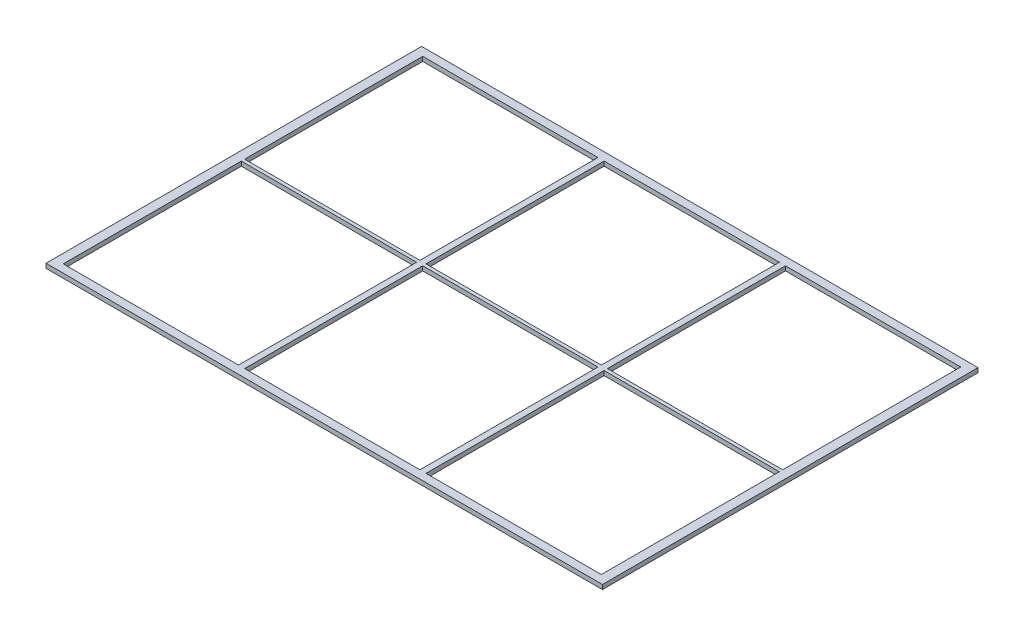
ISO-10303-21;
HEADER;
FILE_DESCRIPTION(('STEP AP214'),'2;1');
FILE_NAME('part.step','',(''),(''),'','','');
FILE_SCHEMA(('AUTOMOTIVE_DESIGN { 1 0 10303 214 1 1 1 1 }'));
ENDSEC;
DATA;
#1=APPLICATION_CONTEXT('core data for automotive mechanical design processes');
#2=APPLICATION_PROTOCOL_DEFINITION('international standard','automotive_design',2000,#1);
#3=PRODUCT_CONTEXT('',#1,'mechanical');
#4=PRODUCT('Part','Part','',(#3));
#5=PRODUCT_RELATED_PRODUCT_CATEGORY('part','',(#4));
#6=PRODUCT_DEFINITION_FORMATION('','',#4);
#7=PRODUCT_DEFINITION_CONTEXT('part definition',#1,'design');
#8=PRODUCT_DEFINITION('design','',#6,#7);
#9=PRODUCT_DEFINITION_SHAPE('','',#8);
#10=(LENGTH_UNIT() NAMED_UNIT(*) SI_UNIT(.MILLI.,.METRE.));
#11=(NAMED_UNIT(*) PLANE_ANGLE_UNIT() SI_UNIT($,.RADIAN.));
#12=(NAMED_UNIT(*) SI_UNIT($,.STERADIAN.) SOLID_ANGLE_UNIT());
#13=UNCERTAINTY_MEASURE_WITH_UNIT(LENGTH_MEASURE(1.E-05),#10,'distance_accuracy_value','');
#14=(GEOMETRIC_REPRESENTATION_CONTEXT(3) GLOBAL_UNCERTAINTY_ASSIGNED_CONTEXT((#13)) GLOBAL_UNIT_ASSIGNED_CONTEXT((#10,
#11,#12)) REPRESENTATION_CONTEXT('',''));
#15=CARTESIAN_POINT('',(0.,0.,0.));
#16=DIRECTION('',(0.,0.,1.));
#17=DIRECTION('',(1.,0.,0.));
#18=AXIS2_PLACEMENT_3D('',#15,#16,#17);
#19=CARTESIAN_POINT('',(33.7,0.,64.6));
#20=DIRECTION('',(0.,0.,1.));
#21=DIRECTION('',(1.,0.,0.));
#22=AXIS2_PLACEMENT_3D('',#19,#20,#21);
#23=PLANE('',#22);
#24=DIRECTION('',(1.,0.,0.));
#25=VECTOR('',#24,1.);
#26=CARTESIAN_POINT('',(33.7,1.6,64.6));
#27=LINE('',#26,#25);
#28=CARTESIAN_POINT('',(33.7,1.6,64.6));
#29=VERTEX_POINT('',#28);
#30=CARTESIAN_POINT('',(96.7,1.6,64.6));
#31=VERTEX_POINT('',#30);
#32=EDGE_CURVE('E513',#29,#31,#27,.T.);
#33=ORIENTED_EDGE('',*,*,#32,.T.);
#34=DIRECTION('',(0.,1.,0.));
#35=VECTOR('',#34,1.);
#36=CARTESIAN_POINT('',(96.7,0.,64.6));
#37=LINE('',#36,#35);
#38=CARTESIAN_POINT('',(96.7,0.,64.6));
#39=VERTEX_POINT('',#38);
#40=EDGE_CURVE('E11',#39,#31,#37,.T.);
#41=ORIENTED_EDGE('',*,*,#40,.F.);
#42=DIRECTION('',(1.,0.,0.));
#43=VECTOR('',#42,1.);
#44=CARTESIAN_POINT('',(33.7,0.,64.6));
#45=LINE('',#44,#43);
#46=CARTESIAN_POINT('',(33.7,0.,64.6));
#47=VERTEX_POINT('',#46);
#48=EDGE_CURVE('E519',#47,#39,#45,.T.);
#49=ORIENTED_EDGE('',*,*,#48,.F.);
#50=DIRECTION('',(0.,1.,0.));
#51=VECTOR('',#50,1.);
#52=CARTESIAN_POINT('',(33.7,0.,64.6));
#53=LINE('',#52,#51);
#54=EDGE_CURVE('E527',#47,#29,#53,.T.);
#55=ORIENTED_EDGE('',*,*,#54,.T.);
#56=EDGE_LOOP('',(#33,#41,#49,#55));
#57=FACE_BOUND('',#56,.T.);
#58=ADVANCED_FACE('F45',(#57),#23,.F.);
#59=CARTESIAN_POINT('',(96.7,0.,0.599999999999976));
#60=DIRECTION('',(1.,0.,0.));
#61=DIRECTION('',(0.,0.,-1.));
#62=AXIS2_PLACEMENT_3D('',#59,#60,#61);
#63=PLANE('',#62);
#64=DIRECTION('',(0.,0.,-1.));
#65=VECTOR('',#64,1.);
#66=CARTESIAN_POINT('',(96.7,1.6,0.599999999999976));
#67=LINE('',#66,#65);
#68=CARTESIAN_POINT('',(96.7,1.6,0.599999999999976));
#69=VERTEX_POINT('',#68);
#70=EDGE_CURVE('E509',#31,#69,#67,.T.);
#71=ORIENTED_EDGE('',*,*,#70,.T.);
#72=DIRECTION('',(0.,1.,0.));
#73=VECTOR('',#72,1.);
#74=CARTESIAN_POINT('',(96.7,0.,0.599999999999976));
#75=LINE('',#74,#73);
#76=CARTESIAN_POINT('',(96.7,0.,0.599999999999976));
#77=VERTEX_POINT('',#76);
#78=EDGE_CURVE('E53',#77,#69,#75,.T.);
#79=ORIENTED_EDGE('',*,*,#78,.F.);
#80=DIRECTION('',(0.,0.,-1.));
#81=VECTOR('',#80,1.);
#82=CARTESIAN_POINT('',(96.7,0.,0.599999999999976));
#83=LINE('',#82,#81);
#84=EDGE_CURVE('E67',#39,#77,#83,.T.);
#85=ORIENTED_EDGE('',*,*,#84,.F.);
#86=ORIENTED_EDGE('',*,*,#40,.T.);
#87=EDGE_LOOP('',(#71,#79,#85,#86));
#88=FACE_BOUND('',#87,.T.);
#89=ADVANCED_FACE('F540',(#88),#63,.F.);
#90=CARTESIAN_POINT('',(33.7,0.,0.599999999999976));
#91=DIRECTION('',(0.,0.,-1.));
#92=DIRECTION('',(-1.,0.,0.));
#93=AXIS2_PLACEMENT_3D('',#90,#91,#92);
#94=PLANE('',#93);
#95=DIRECTION('',(-1.,0.,0.));
#96=VECTOR('',#95,1.);
#97=CARTESIAN_POINT('',(33.7,1.6,0.599999999999976));
#98=LINE('',#97,#96);
#99=CARTESIAN_POINT('',(33.7,1.6,0.599999999999976));
#100=VERTEX_POINT('',#99);
#101=EDGE_CURVE('E505',#69,#100,#98,.T.);
#102=ORIENTED_EDGE('',*,*,#101,.T.);
#103=DIRECTION('',(0.,1.,0.));
#104=VECTOR('',#103,1.);
#105=CARTESIAN_POINT('',(33.7,0.,0.599999999999976));
#106=LINE('',#105,#104);
#107=CARTESIAN_POINT('',(33.7,0.,0.599999999999976));
#108=VERTEX_POINT('',#107);
#109=EDGE_CURVE('E531',#108,#100,#106,.T.);
#110=ORIENTED_EDGE('',*,*,#109,.F.);
#111=DIRECTION('',(-1.,0.,0.));
#112=VECTOR('',#111,1.);
#113=CARTESIAN_POINT('',(33.7,0.,0.599999999999976));
#114=LINE('',#113,#112);
#115=EDGE_CURVE('E524',#77,#108,#114,.T.);
#116=ORIENTED_EDGE('',*,*,#115,.F.);
#117=ORIENTED_EDGE('',*,*,#78,.T.);
#118=EDGE_LOOP('',(#102,#110,#116,#117));
#119=FACE_BOUND('',#118,.T.);
#120=ADVANCED_FACE('F537',(#119),#94,.F.);
#121=CARTESIAN_POINT('',(33.7,0.,0.599999999999976));
#122=DIRECTION('',(-1.,0.,0.));
#123=DIRECTION('',(0.,0.,1.));
#124=AXIS2_PLACEMENT_3D('',#121,#122,#123);
#125=PLANE('',#124);
#126=DIRECTION('',(0.,0.,1.));
#127=VECTOR('',#126,1.);
#128=CARTESIAN_POINT('',(33.7,1.6,0.599999999999976));
#129=LINE('',#128,#127);
#130=EDGE_CURVE('E502',#100,#29,#129,.T.);
#131=ORIENTED_EDGE('',*,*,#130,.T.);
#132=ORIENTED_EDGE('',*,*,#54,.F.);
#133=DIRECTION('',(0.,0.,1.));
#134=VECTOR('',#133,1.);
#135=CARTESIAN_POINT('',(33.7,0.,0.599999999999976));
#136=LINE('',#135,#134);
#137=EDGE_CURVE('E60',#108,#47,#136,.T.);
#138=ORIENTED_EDGE('',*,*,#137,.F.);
#139=ORIENTED_EDGE('',*,*,#109,.T.);
#140=EDGE_LOOP('',(#131,#132,#138,#139));
#141=FACE_BOUND('',#140,.T.);
#142=ADVANCED_FACE('F546',(#141),#125,.F.);
#143=CARTESIAN_POINT('',(-31.5,0.,64.6));
#144=DIRECTION('',(0.,0.,1.));
#145=DIRECTION('',(1.,0.,0.));
#146=AXIS2_PLACEMENT_3D('',#143,#144,#145);
#147=PLANE('',#146);
#148=DIRECTION('',(1.,0.,0.));
#149=VECTOR('',#148,1.);
#150=CARTESIAN_POINT('',(-31.5,1.6,64.6));
#151=LINE('',#150,#149);
#152=CARTESIAN_POINT('',(-31.5,1.6,64.6));
#153=VERTEX_POINT('',#152);
#154=CARTESIAN_POINT('',(31.5,1.6,64.6));
#155=VERTEX_POINT('',#154);
#156=EDGE_CURVE('E469',#153,#155,#151,.T.);
#157=ORIENTED_EDGE('',*,*,#156,.T.);
#158=DIRECTION('',(0.,1.,0.));
#159=VECTOR('',#158,1.);
#160=CARTESIAN_POINT('',(31.5,0.,64.6));
#161=LINE('',#160,#159);
#162=CARTESIAN_POINT('',(31.5,0.,64.6));
#163=VERTEX_POINT('',#162);
#164=EDGE_CURVE('E498',#163,#155,#161,.T.);
#165=ORIENTED_EDGE('',*,*,#164,.F.);
#166=DIRECTION('',(1.,0.,0.));
#167=VECTOR('',#166,1.);
#168=CARTESIAN_POINT('',(-31.5,0.,64.6));
#169=LINE('',#168,#167);
#170=CARTESIAN_POINT('',(-31.5,0.,64.6));
#171=VERTEX_POINT('',#170);
#172=EDGE_CURVE('E476',#171,#163,#169,.T.);
#173=ORIENTED_EDGE('',*,*,#172,.F.);
#174=DIRECTION('',(0.,1.,0.));
#175=VECTOR('',#174,1.);
#176=CARTESIAN_POINT('',(-31.5,0.,64.6));
#177=LINE('',#176,#175);
#178=EDGE_CURVE('E486',#171,#153,#177,.T.);
#179=ORIENTED_EDGE('',*,*,#178,.T.);
#180=EDGE_LOOP('',(#157,#165,#173,#179));
#181=FACE_BOUND('',#180,.T.);
#182=ADVANCED_FACE('F548',(#181),#147,.F.);
#183=CARTESIAN_POINT('',(31.5,0.,0.599999999999976));
#184=DIRECTION('',(1.,0.,0.));
#185=DIRECTION('',(0.,0.,-1.));
#186=AXIS2_PLACEMENT_3D('',#183,#184,#185);
#187=PLANE('',#186);
#188=DIRECTION('',(0.,0.,-1.));
#189=VECTOR('',#188,1.);
#190=CARTESIAN_POINT('',(31.5,1.6,0.599999999999976));
#191=LINE('',#190,#189);
#192=CARTESIAN_POINT('',(31.5,1.6,0.599999999999976));
#193=VERTEX_POINT('',#192);
#194=EDGE_CURVE('E465',#155,#193,#191,.T.);
#195=ORIENTED_EDGE('',*,*,#194,.T.);
#196=DIRECTION('',(0.,1.,0.));
#197=VECTOR('',#196,1.);
#198=CARTESIAN_POINT('',(31.5,0.,0.599999999999976));
#199=LINE('',#198,#197);
#200=CARTESIAN_POINT('',(31.5,0.,0.599999999999976));
#201=VERTEX_POINT('',#200);
#202=EDGE_CURVE('E494',#201,#193,#199,.T.);
#203=ORIENTED_EDGE('',*,*,#202,.F.);
#204=DIRECTION('',(0.,0.,-1.));
#205=VECTOR('',#204,1.);
#206=CARTESIAN_POINT('',(31.5,0.,0.599999999999976));
#207=LINE('',#206,#205);
#208=EDGE_CURVE('E479',#163,#201,#207,.T.);
#209=ORIENTED_EDGE('',*,*,#208,.F.);
#210=ORIENTED_EDGE('',*,*,#164,.T.);
#211=EDGE_LOOP('',(#195,#203,#209,#210));
#212=FACE_BOUND('',#211,.T.);
#213=ADVANCED_FACE('F554',(#212),#187,.F.);
#214=CARTESIAN_POINT('',(-31.5,0.,0.599999999999976));
#215=DIRECTION('',(0.,0.,-1.));
#216=DIRECTION('',(-1.,0.,0.));
#217=AXIS2_PLACEMENT_3D('',#214,#215,#216);
#218=PLANE('',#217);
#219=DIRECTION('',(-1.,0.,0.));
#220=VECTOR('',#219,1.);
#221=CARTESIAN_POINT('',(-31.5,1.6,0.599999999999976));
#222=LINE('',#221,#220);
#223=CARTESIAN_POINT('',(-31.5,1.6,0.599999999999976));
#224=VERTEX_POINT('',#223);
#225=EDGE_CURVE('E461',#193,#224,#222,.T.);
#226=ORIENTED_EDGE('',*,*,#225,.T.);
#227=DIRECTION('',(0.,1.,0.));
#228=VECTOR('',#227,1.);
#229=CARTESIAN_POINT('',(-31.5,0.,0.599999999999976));
#230=LINE('',#229,#228);
#231=CARTESIAN_POINT('',(-31.5,0.,0.599999999999976));
#232=VERTEX_POINT('',#231);
#233=EDGE_CURVE('E490',#232,#224,#230,.T.);
#234=ORIENTED_EDGE('',*,*,#233,.F.);
#235=DIRECTION('',(-1.,0.,0.));
#236=VECTOR('',#235,1.);
#237=CARTESIAN_POINT('',(-31.5,0.,0.599999999999976));
#238=LINE('',#237,#236);
#239=EDGE_CURVE('E482',#201,#232,#238,.T.);
#240=ORIENTED_EDGE('',*,*,#239,.F.);
#241=ORIENTED_EDGE('',*,*,#202,.T.);
#242=EDGE_LOOP('',(#226,#234,#240,#241));
#243=FACE_BOUND('',#242,.T.);
#244=ADVANCED_FACE('F590',(#243),#218,.F.);
#245=CARTESIAN_POINT('',(-31.5,0.,0.599999999999976));
#246=DIRECTION('',(-1.,0.,0.));
#247=DIRECTION('',(0.,0.,1.));
#248=AXIS2_PLACEMENT_3D('',#245,#246,#247);
#249=PLANE('',#248);
#250=DIRECTION('',(0.,0.,1.));
#251=VECTOR('',#250,1.);
#252=CARTESIAN_POINT('',(-31.5,1.6,0.599999999999976));
#253=LINE('',#252,#251);
#254=EDGE_CURVE('E458',#224,#153,#253,.T.);
#255=ORIENTED_EDGE('',*,*,#254,.T.);
#256=ORIENTED_EDGE('',*,*,#178,.F.);
#257=DIRECTION('',(0.,0.,1.));
#258=VECTOR('',#257,1.);
#259=CARTESIAN_POINT('',(-31.5,0.,0.599999999999976));
#260=LINE('',#259,#258);
#261=EDGE_CURVE('E473',#232,#171,#260,.T.);
#262=ORIENTED_EDGE('',*,*,#261,.F.);
#263=ORIENTED_EDGE('',*,*,#233,.T.);
#264=EDGE_LOOP('',(#255,#256,#262,#263));
#265=FACE_BOUND('',#264,.T.);
#266=ADVANCED_FACE('F600',(#265),#249,.F.);
#267=CARTESIAN_POINT('',(-96.7,0.,64.6));
#268=DIRECTION('',(0.,0.,1.));
#269=DIRECTION('',(1.,0.,0.));
#270=AXIS2_PLACEMENT_3D('',#267,#268,#269);
#271=PLANE('',#270);
#272=DIRECTION('',(1.,0.,0.));
#273=VECTOR('',#272,1.);
#274=CARTESIAN_POINT('',(-96.7,1.6,64.6));
#275=LINE('',#274,#273);
#276=CARTESIAN_POINT('',(-96.7,1.6,64.6));
#277=VERTEX_POINT('',#276);
#278=CARTESIAN_POINT('',(-33.7,1.6,64.6));
#279=VERTEX_POINT('',#278);
#280=EDGE_CURVE('E425',#277,#279,#275,.T.);
#281=ORIENTED_EDGE('',*,*,#280,.T.);
#282=DIRECTION('',(0.,1.,0.));
#283=VECTOR('',#282,1.);
#284=CARTESIAN_POINT('',(-33.7,0.,64.6));
#285=LINE('',#284,#283);
#286=CARTESIAN_POINT('',(-33.7,0.,64.6));
#287=VERTEX_POINT('',#286);
#288=EDGE_CURVE('E454',#287,#279,#285,.T.);
#289=ORIENTED_EDGE('',*,*,#288,.F.);
#290=DIRECTION('',(1.,0.,0.));
#291=VECTOR('',#290,1.);
#292=CARTESIAN_POINT('',(-96.7,0.,64.6));
#293=LINE('',#292,#291);
#294=CARTESIAN_POINT('',(-96.7,0.,64.6));
#295=VERTEX_POINT('',#294);
#296=EDGE_CURVE('E432',#295,#287,#293,.T.);
#297=ORIENTED_EDGE('',*,*,#296,.F.);
#298=DIRECTION('',(0.,1.,0.));
#299=VECTOR('',#298,1.);
#300=CARTESIAN_POINT('',(-96.7,0.,64.6));
#301=LINE('',#300,#299);
#302=EDGE_CURVE('E442',#295,#277,#301,.T.);
#303=ORIENTED_EDGE('',*,*,#302,.T.);
#304=EDGE_LOOP('',(#281,#289,#297,#303));
#305=FACE_BOUND('',#304,.T.);
#306=ADVANCED_FACE('F610',(#305),#271,.F.);
#307=CARTESIAN_POINT('',(-33.7,0.,0.599999999999989));
#308=DIRECTION('',(1.,0.,0.));
#309=DIRECTION('',(0.,0.,-1.));
#310=AXIS2_PLACEMENT_3D('',#307,#308,#309);
#311=PLANE('',#310);
#312=DIRECTION('',(0.,0.,-1.));
#313=VECTOR('',#312,1.);
#314=CARTESIAN_POINT('',(-33.7,1.6,0.599999999999989));
#315=LINE('',#314,#313);
#316=CARTESIAN_POINT('',(-33.7,1.6,0.599999999999989));
#317=VERTEX_POINT('',#316);
#318=EDGE_CURVE('E421',#279,#317,#315,.T.);
#319=ORIENTED_EDGE('',*,*,#318,.T.);
#320=DIRECTION('',(0.,1.,0.));
#321=VECTOR('',#320,1.);
#322=CARTESIAN_POINT('',(-33.7,0.,0.599999999999989));
#323=LINE('',#322,#321);
#324=CARTESIAN_POINT('',(-33.7,0.,0.599999999999989));
#325=VERTEX_POINT('',#324);
#326=EDGE_CURVE('E450',#325,#317,#323,.T.);
#327=ORIENTED_EDGE('',*,*,#326,.F.);
#328=DIRECTION('',(0.,0.,-1.));
#329=VECTOR('',#328,1.);
#330=CARTESIAN_POINT('',(-33.7,0.,0.599999999999989));
#331=LINE('',#330,#329);
#332=EDGE_CURVE('E435',#287,#325,#331,.T.);
#333=ORIENTED_EDGE('',*,*,#332,.F.);
#334=ORIENTED_EDGE('',*,*,#288,.T.);
#335=EDGE_LOOP('',(#319,#327,#333,#334));
#336=FACE_BOUND('',#335,.T.);
#337=ADVANCED_FACE('F620',(#336),#311,.F.);
#338=CARTESIAN_POINT('',(-96.7,0.,0.599999999999989));
#339=DIRECTION('',(0.,0.,-1.));
#340=DIRECTION('',(-1.,0.,0.));
#341=AXIS2_PLACEMENT_3D('',#338,#339,#340);
#342=PLANE('',#341);
#343=DIRECTION('',(-1.,0.,0.));
#344=VECTOR('',#343,1.);
#345=CARTESIAN_POINT('',(-96.7,1.6,0.599999999999989));
#346=LINE('',#345,#344);
#347=CARTESIAN_POINT('',(-96.7,1.6,0.599999999999989));
#348=VERTEX_POINT('',#347);
#349=EDGE_CURVE('E417',#317,#348,#346,.T.);
#350=ORIENTED_EDGE('',*,*,#349,.T.);
#351=DIRECTION('',(0.,1.,0.));
#352=VECTOR('',#351,1.);
#353=CARTESIAN_POINT('',(-96.7,0.,0.599999999999989));
#354=LINE('',#353,#352);
#355=CARTESIAN_POINT('',(-96.7,0.,0.599999999999989));
#356=VERTEX_POINT('',#355);
#357=EDGE_CURVE('E446',#356,#348,#354,.T.);
#358=ORIENTED_EDGE('',*,*,#357,.F.);
#359=DIRECTION('',(-1.,0.,0.));
#360=VECTOR('',#359,1.);
#361=CARTESIAN_POINT('',(-96.7,0.,0.599999999999989));
#362=LINE('',#361,#360);
#363=EDGE_CURVE('E438',#325,#356,#362,.T.);
#364=ORIENTED_EDGE('',*,*,#363,.F.);
#365=ORIENTED_EDGE('',*,*,#326,.T.);
#366=EDGE_LOOP('',(#350,#358,#364,#365));
#367=FACE_BOUND('',#366,.T.);
#368=ADVANCED_FACE('F630',(#367),#342,.F.);
#369=CARTESIAN_POINT('',(-96.7,0.,0.599999999999989));
#370=DIRECTION('',(-1.,0.,0.));
#371=DIRECTION('',(0.,0.,1.));
#372=AXIS2_PLACEMENT_3D('',#369,#370,#371);
#373=PLANE('',#372);
#374=DIRECTION('',(0.,0.,1.));
#375=VECTOR('',#374,1.);
#376=CARTESIAN_POINT('',(-96.7,1.6,0.599999999999989));
#377=LINE('',#376,#375);
#378=EDGE_CURVE('E414',#348,#277,#377,.T.);
#379=ORIENTED_EDGE('',*,*,#378,.T.);
#380=ORIENTED_EDGE('',*,*,#302,.F.);
#381=DIRECTION('',(0.,0.,1.));
#382=VECTOR('',#381,1.);
#383=CARTESIAN_POINT('',(-96.7,0.,0.599999999999989));
#384=LINE('',#383,#382);
#385=EDGE_CURVE('E429',#356,#295,#384,.T.);
#386=ORIENTED_EDGE('',*,*,#385,.F.);
#387=ORIENTED_EDGE('',*,*,#357,.T.);
#388=EDGE_LOOP('',(#379,#380,#386,#387));
#389=FACE_BOUND('',#388,.T.);
#390=ADVANCED_FACE('F640',(#389),#373,.F.);
#391=CARTESIAN_POINT('',(33.7,0.,-0.600000000000035));
#392=DIRECTION('',(0.,0.,1.));
#393=DIRECTION('',(1.,0.,0.));
#394=AXIS2_PLACEMENT_3D('',#391,#392,#393);
#395=PLANE('',#394);
#396=DIRECTION('',(1.,0.,0.));
#397=VECTOR('',#396,1.);
#398=CARTESIAN_POINT('',(33.7,1.6,-0.600000000000035));
#399=LINE('',#398,#397);
#400=CARTESIAN_POINT('',(33.7,1.6,-0.600000000000035));
#401=VERTEX_POINT('',#400);
#402=CARTESIAN_POINT('',(96.7,1.6,-0.600000000000035));
#403=VERTEX_POINT('',#402);
#404=EDGE_CURVE('E381',#401,#403,#399,.T.);
#405=ORIENTED_EDGE('',*,*,#404,.T.);
#406=DIRECTION('',(0.,1.,0.));
#407=VECTOR('',#406,1.);
#408=CARTESIAN_POINT('',(96.7,0.,-0.600000000000035));
#409=LINE('',#408,#407);
#410=CARTESIAN_POINT('',(96.7,0.,-0.600000000000035));
#411=VERTEX_POINT('',#410);
#412=EDGE_CURVE('E410',#411,#403,#409,.T.);
#413=ORIENTED_EDGE('',*,*,#412,.F.);
#414=DIRECTION('',(1.,0.,0.));
#415=VECTOR('',#414,1.);
#416=CARTESIAN_POINT('',(33.7,0.,-0.600000000000035));
#417=LINE('',#416,#415);
#418=CARTESIAN_POINT('',(33.7,0.,-0.600000000000035));
#419=VERTEX_POINT('',#418);
#420=EDGE_CURVE('E388',#419,#411,#417,.T.);
#421=ORIENTED_EDGE('',*,*,#420,.F.);
#422=DIRECTION('',(0.,1.,0.));
#423=VECTOR('',#422,1.);
#424=CARTESIAN_POINT('',(33.7,0.,-0.600000000000035));
#425=LINE('',#424,#423);
#426=EDGE_CURVE('E398',#419,#401,#425,.T.);
#427=ORIENTED_EDGE('',*,*,#426,.T.);
#428=EDGE_LOOP('',(#405,#413,#421,#427));
#429=FACE_BOUND('',#428,.T.);
#430=ADVANCED_FACE('F650',(#429),#395,.F.);
#431=CARTESIAN_POINT('',(96.7,0.,-64.6000000000001));
#432=DIRECTION('',(1.,0.,0.));
#433=DIRECTION('',(0.,0.,-1.));
#434=AXIS2_PLACEMENT_3D('',#431,#432,#433);
#435=PLANE('',#434);
#436=DIRECTION('',(0.,0.,-1.));
#437=VECTOR('',#436,1.);
#438=CARTESIAN_POINT('',(96.7,1.6,-64.6000000000001));
#439=LINE('',#438,#437);
#440=CARTESIAN_POINT('',(96.7,1.6,-64.6000000000001));
#441=VERTEX_POINT('',#440);
#442=EDGE_CURVE('E377',#403,#441,#439,.T.);
#443=ORIENTED_EDGE('',*,*,#442,.T.);
#444=DIRECTION('',(0.,1.,0.));
#445=VECTOR('',#444,1.);
#446=CARTESIAN_POINT('',(96.7,0.,-64.6000000000001));
#447=LINE('',#446,#445);
#448=CARTESIAN_POINT('',(96.7,0.,-64.6000000000001));
#449=VERTEX_POINT('',#448);
#450=EDGE_CURVE('E406',#449,#441,#447,.T.);
#451=ORIENTED_EDGE('',*,*,#450,.F.);
#452=DIRECTION('',(0.,0.,-1.));
#453=VECTOR('',#452,1.);
#454=CARTESIAN_POINT('',(96.7,0.,-64.6000000000001));
#455=LINE('',#454,#453);
#456=EDGE_CURVE('E391',#411,#449,#455,.T.);
#457=ORIENTED_EDGE('',*,*,#456,.F.);
#458=ORIENTED_EDGE('',*,*,#412,.T.);
#459=EDGE_LOOP('',(#443,#451,#457,#458));
#460=FACE_BOUND('',#459,.T.);
#461=ADVANCED_FACE('F660',(#460),#435,.F.);
#462=CARTESIAN_POINT('',(33.7,0.,-64.6000000000001));
#463=DIRECTION('',(0.,0.,-1.));
#464=DIRECTION('',(-1.,0.,0.));
#465=AXIS2_PLACEMENT_3D('',#462,#463,#464);
#466=PLANE('',#465);
#467=DIRECTION('',(-1.,0.,0.));
#468=VECTOR('',#467,1.);
#469=CARTESIAN_POINT('',(33.7,1.6,-64.6000000000001));
#470=LINE('',#469,#468);
#471=CARTESIAN_POINT('',(33.7,1.6,-64.6000000000001));
#472=VERTEX_POINT('',#471);
#473=EDGE_CURVE('E373',#441,#472,#470,.T.);
#474=ORIENTED_EDGE('',*,*,#473,.T.);
#475=DIRECTION('',(0.,1.,0.));
#476=VECTOR('',#475,1.);
#477=CARTESIAN_POINT('',(33.7,0.,-64.6000000000001));
#478=LINE('',#477,#476);
#479=CARTESIAN_POINT('',(33.7,0.,-64.6000000000001));
#480=VERTEX_POINT('',#479);
#481=EDGE_CURVE('E402',#480,#472,#478,.T.);
#482=ORIENTED_EDGE('',*,*,#481,.F.);
#483=DIRECTION('',(-1.,0.,0.));
#484=VECTOR('',#483,1.);
#485=CARTESIAN_POINT('',(33.7,0.,-64.6000000000001));
#486=LINE('',#485,#484);
#487=EDGE_CURVE('E394',#449,#480,#486,.T.);
#488=ORIENTED_EDGE('',*,*,#487,.F.);
#489=ORIENTED_EDGE('',*,*,#450,.T.);
#490=EDGE_LOOP('',(#474,#482,#488,#489));
#491=FACE_BOUND('',#490,.T.);
#492=ADVANCED_FACE('F670',(#491),#466,.F.);
#493=CARTESIAN_POINT('',(33.7,0.,-64.6000000000001));
#494=DIRECTION('',(-1.,0.,0.));
#495=DIRECTION('',(0.,0.,1.));
#496=AXIS2_PLACEMENT_3D('',#493,#494,#495);
#497=PLANE('',#496);
#498=DIRECTION('',(0.,0.,1.));
#499=VECTOR('',#498,1.);
#500=CARTESIAN_POINT('',(33.7,1.6,-64.6000000000001));
#501=LINE('',#500,#499);
#502=EDGE_CURVE('E370',#472,#401,#501,.T.);
#503=ORIENTED_EDGE('',*,*,#502,.T.);
#504=ORIENTED_EDGE('',*,*,#426,.F.);
#505=DIRECTION('',(0.,0.,1.));
#506=VECTOR('',#505,1.);
#507=CARTESIAN_POINT('',(33.7,0.,-64.6000000000001));
#508=LINE('',#507,#506);
#509=EDGE_CURVE('E385',#480,#419,#508,.T.);
#510=ORIENTED_EDGE('',*,*,#509,.F.);
#511=ORIENTED_EDGE('',*,*,#481,.T.);
#512=EDGE_LOOP('',(#503,#504,#510,#511));
#513=FACE_BOUND('',#512,.T.);
#514=ADVANCED_FACE('F680',(#513),#497,.F.);
#515=CARTESIAN_POINT('',(-100.,1.6,67.5));
#516=DIRECTION('',(1.,0.,0.));
#517=DIRECTION('',(0.,0.,-1.));
#518=AXIS2_PLACEMENT_3D('',#515,#516,#517);
#519=PLANE('',#518);
#520=DIRECTION('',(0.,0.,1.));
#521=VECTOR('',#520,1.);
#522=CARTESIAN_POINT('',(-100.,0.,67.5));
#523=LINE('',#522,#521);
#524=CARTESIAN_POINT('',(-100.,0.,-67.5));
#525=VERTEX_POINT('',#524);
#526=CARTESIAN_POINT('',(-100.,0.,67.5));
#527=VERTEX_POINT('',#526);
#528=EDGE_CURVE('E319',#525,#527,#523,.T.);
#529=ORIENTED_EDGE('',*,*,#528,.T.);
#530=DIRECTION('',(0.,-1.,0.));
#531=VECTOR('',#530,1.);
#532=CARTESIAN_POINT('',(-100.,1.6,67.5));
#533=LINE('',#532,#531);
#534=CARTESIAN_POINT('',(-100.,1.6,67.5));
#535=VERTEX_POINT('',#534);
#536=EDGE_CURVE('E366',#535,#527,#533,.T.);
#537=ORIENTED_EDGE('',*,*,#536,.F.);
#538=DIRECTION('',(0.,0.,1.));
#539=VECTOR('',#538,1.);
#540=CARTESIAN_POINT('',(-100.,1.6,67.5));
#541=LINE('',#540,#539);
#542=CARTESIAN_POINT('',(-100.,1.6,-67.5));
#543=VERTEX_POINT('',#542);
#544=EDGE_CURVE('E329',#543,#535,#541,.T.);
#545=ORIENTED_EDGE('',*,*,#544,.F.);
#546=DIRECTION('',(0.,-1.,0.));
#547=VECTOR('',#546,1.);
#548=CARTESIAN_POINT('',(-100.,1.6,-67.5));
#549=LINE('',#548,#547);
#550=EDGE_CURVE('E343',#543,#525,#549,.T.);
#551=ORIENTED_EDGE('',*,*,#550,.T.);
#552=EDGE_LOOP('',(#529,#537,#545,#551));
#553=FACE_BOUND('',#552,.T.);
#554=ADVANCED_FACE('F690',(#553),#519,.F.);
#555=CARTESIAN_POINT('',(100.,1.6,67.5));
#556=DIRECTION('',(0.,0.,-1.));
#557=DIRECTION('',(-1.,0.,0.));
#558=AXIS2_PLACEMENT_3D('',#555,#556,#557);
#559=PLANE('',#558);
#560=DIRECTION('',(1.,0.,0.));
#561=VECTOR('',#560,1.);
#562=CARTESIAN_POINT('',(100.,0.,67.5));
#563=LINE('',#562,#561);
#564=CARTESIAN_POINT('',(100.,0.,67.5));
#565=VERTEX_POINT('',#564);
#566=EDGE_CURVE('E347',#527,#565,#563,.T.);
#567=ORIENTED_EDGE('',*,*,#566,.T.);
#568=DIRECTION('',(0.,-1.,0.));
#569=VECTOR('',#568,1.);
#570=CARTESIAN_POINT('',(100.,1.6,67.5));
#571=LINE('',#570,#569);
#572=CARTESIAN_POINT('',(100.,1.6,67.5));
#573=VERTEX_POINT('',#572);
#574=EDGE_CURVE('E362',#573,#565,#571,.T.);
#575=ORIENTED_EDGE('',*,*,#574,.F.);
#576=DIRECTION('',(1.,0.,0.));
#577=VECTOR('',#576,1.);
#578=CARTESIAN_POINT('',(100.,1.6,67.5));
#579=LINE('',#578,#577);
#580=EDGE_CURVE('E333',#535,#573,#579,.T.);
#581=ORIENTED_EDGE('',*,*,#580,.F.);
#582=ORIENTED_EDGE('',*,*,#536,.T.);
#583=EDGE_LOOP('',(#567,#575,#581,#582));
#584=FACE_BOUND('',#583,.T.);
#585=ADVANCED_FACE('F760',(#584),#559,.F.);
#586=CARTESIAN_POINT('',(100.,1.6,67.5));
#587=DIRECTION('',(-1.,0.,0.));
#588=DIRECTION('',(0.,0.,1.));
#589=AXIS2_PLACEMENT_3D('',#586,#587,#588);
#590=PLANE('',#589);
#591=DIRECTION('',(0.,0.,-1.));
#592=VECTOR('',#591,1.);
#593=CARTESIAN_POINT('',(100.,0.,67.5));
#594=LINE('',#593,#592);
#595=CARTESIAN_POINT('',(100.,0.,-67.5));
#596=VERTEX_POINT('',#595);
#597=EDGE_CURVE('E350',#565,#596,#594,.T.);
#598=ORIENTED_EDGE('',*,*,#597,.T.);
#599=DIRECTION('',(0.,-1.,0.));
#600=VECTOR('',#599,1.);
#601=CARTESIAN_POINT('',(100.,1.6,-67.5));
#602=LINE('',#601,#600);
#603=CARTESIAN_POINT('',(100.,1.6,-67.5));
#604=VERTEX_POINT('',#603);
#605=EDGE_CURVE('E358',#604,#596,#602,.T.);
#606=ORIENTED_EDGE('',*,*,#605,.F.);
#607=DIRECTION('',(0.,0.,-1.));
#608=VECTOR('',#607,1.);
#609=CARTESIAN_POINT('',(100.,1.6,67.5));
#610=LINE('',#609,#608);
#611=EDGE_CURVE('E337',#573,#604,#610,.T.);
#612=ORIENTED_EDGE('',*,*,#611,.F.);
#613=ORIENTED_EDGE('',*,*,#574,.T.);
#614=EDGE_LOOP('',(#598,#606,#612,#613));
#615=FACE_BOUND('',#614,.T.);
#616=ADVANCED_FACE('F756',(#615),#590,.F.);
#617=CARTESIAN_POINT('',(100.,1.6,-67.5));
#618=DIRECTION('',(0.,0.,1.));
#619=DIRECTION('',(1.,0.,0.));
#620=AXIS2_PLACEMENT_3D('',#617,#618,#619);
#621=PLANE('',#620);
#622=DIRECTION('',(-1.,0.,0.));
#623=VECTOR('',#622,1.);
#624=CARTESIAN_POINT('',(100.,0.,-67.5));
#625=LINE('',#624,#623);
#626=EDGE_CURVE('E334',#596,#525,#625,.T.);
#627=ORIENTED_EDGE('',*,*,#626,.T.);
#628=ORIENTED_EDGE('',*,*,#550,.F.);
#629=DIRECTION('',(-1.,0.,0.));
#630=VECTOR('',#629,1.);
#631=CARTESIAN_POINT('',(100.,1.6,-67.5));
#632=LINE('',#631,#630);
#633=EDGE_CURVE('E340',#604,#543,#632,.T.);
#634=ORIENTED_EDGE('',*,*,#633,.F.);
#635=ORIENTED_EDGE('',*,*,#605,.T.);
#636=EDGE_LOOP('',(#627,#628,#634,#635));
#637=FACE_BOUND('',#636,.T.);
#638=ADVANCED_FACE('F751',(#637),#621,.F.);
#639=CARTESIAN_POINT('',(0.,1.6,0.));
#640=DIRECTION('',(0.,1.,0.));
#641=DIRECTION('',(0.,0.,1.));
#642=AXIS2_PLACEMENT_3D('',#639,#640,#641);
#643=PLANE('',#642);
#644=DIRECTION('',(0.,0.,1.));
#645=VECTOR('',#644,1.);
#646=CARTESIAN_POINT('',(-31.5,1.6,-64.6));
#647=LINE('',#646,#645);
#648=CARTESIAN_POINT('',(-31.5,1.6,-64.6));
#649=VERTEX_POINT('',#648);
#650=CARTESIAN_POINT('',(-31.5,1.6,-0.600000000000026));
#651=VERTEX_POINT('',#650);
#652=EDGE_CURVE('E277',#649,#651,#647,.T.);
#653=ORIENTED_EDGE('',*,*,#652,.F.);
#654=DIRECTION('',(-1.,0.,0.));
#655=VECTOR('',#654,1.);
#656=CARTESIAN_POINT('',(-31.5,1.6,-64.6));
#657=LINE('',#656,#655);
#658=CARTESIAN_POINT('',(31.5,1.6,-64.6));
#659=VERTEX_POINT('',#658);
#660=EDGE_CURVE('E256',#659,#649,#657,.T.);
#661=ORIENTED_EDGE('',*,*,#660,.F.);
#662=DIRECTION('',(0.,0.,-1.));
#663=VECTOR('',#662,1.);
#664=CARTESIAN_POINT('',(31.5,1.6,-64.6));
#665=LINE('',#664,#663);
#666=CARTESIAN_POINT('',(31.5,1.6,-0.600000000000026));
#667=VERTEX_POINT('',#666);
#668=EDGE_CURVE('E247',#667,#659,#665,.T.);
#669=ORIENTED_EDGE('',*,*,#668,.F.);
#670=DIRECTION('',(1.,0.,0.));
#671=VECTOR('',#670,1.);
#672=CARTESIAN_POINT('',(-31.5,1.6,-0.600000000000026));
#673=LINE('',#672,#671);
#674=EDGE_CURVE('E232',#651,#667,#673,.T.);
#675=ORIENTED_EDGE('',*,*,#674,.F.);
#676=EDGE_LOOP('',(#653,#661,#669,#675));
#677=FACE_BOUND('',#676,.T.);
#678=DIRECTION('',(0.,0.,1.));
#679=VECTOR('',#678,1.);
#680=CARTESIAN_POINT('',(-96.7,1.6,-64.6));
#681=LINE('',#680,#679);
#682=CARTESIAN_POINT('',(-96.7,1.6,-64.6));
#683=VERTEX_POINT('',#682);
#684=CARTESIAN_POINT('',(-96.7,1.6,-0.600000000000017));
#685=VERTEX_POINT('',#684);
#686=EDGE_CURVE('E284',#683,#685,#681,.T.);
#687=ORIENTED_EDGE('',*,*,#686,.F.);
#688=DIRECTION('',(-1.,0.,0.));
#689=VECTOR('',#688,1.);
#690=CARTESIAN_POINT('',(-96.7,1.6,-64.6));
#691=LINE('',#690,#689);
#692=CARTESIAN_POINT('',(-33.7,1.6,-64.6));
#693=VERTEX_POINT('',#692);
#694=EDGE_CURVE('E290',#693,#683,#691,.T.);
#695=ORIENTED_EDGE('',*,*,#694,.F.);
#696=DIRECTION('',(0.,0.,-1.));
#697=VECTOR('',#696,1.);
#698=CARTESIAN_POINT('',(-33.7,1.6,-64.6));
#699=LINE('',#698,#697);
#700=CARTESIAN_POINT('',(-33.7,1.6,-0.600000000000017));
#701=VERTEX_POINT('',#700);
#702=EDGE_CURVE('E309',#701,#693,#699,.T.);
#703=ORIENTED_EDGE('',*,*,#702,.F.);
#704=DIRECTION('',(1.,0.,0.));
#705=VECTOR('',#704,1.);
#706=CARTESIAN_POINT('',(-96.7,1.6,-0.600000000000017));
#707=LINE('',#706,#705);
#708=EDGE_CURVE('E305',#685,#701,#707,.T.);
#709=ORIENTED_EDGE('',*,*,#708,.F.);
#710=EDGE_LOOP('',(#687,#695,#703,#709));
#711=FACE_BOUND('',#710,.T.);
#712=ORIENTED_EDGE('',*,*,#544,.T.);
#713=ORIENTED_EDGE('',*,*,#580,.T.);
#714=ORIENTED_EDGE('',*,*,#611,.T.);
#715=ORIENTED_EDGE('',*,*,#633,.T.);
#716=EDGE_LOOP('',(#712,#713,#714,#715));
#717=FACE_BOUND('',#716,.T.);
#718=ORIENTED_EDGE('',*,*,#502,.F.);
#719=ORIENTED_EDGE('',*,*,#473,.F.);
#720=ORIENTED_EDGE('',*,*,#442,.F.);
#721=ORIENTED_EDGE('',*,*,#404,.F.);
#722=EDGE_LOOP('',(#718,#719,#720,#721));
#723=FACE_BOUND('',#722,.T.);
#724=ORIENTED_EDGE('',*,*,#378,.F.);
#725=ORIENTED_EDGE('',*,*,#349,.F.);
#726=ORIENTED_EDGE('',*,*,#318,.F.);
#727=ORIENTED_EDGE('',*,*,#280,.F.);
#728=EDGE_LOOP('',(#724,#725,#726,#727));
#729=FACE_BOUND('',#728,.T.);
#730=ORIENTED_EDGE('',*,*,#254,.F.);
#731=ORIENTED_EDGE('',*,*,#225,.F.);
#732=ORIENTED_EDGE('',*,*,#194,.F.);
#733=ORIENTED_EDGE('',*,*,#156,.F.);
#734=EDGE_LOOP('',(#730,#731,#732,#733));
#735=FACE_BOUND('',#734,.T.);
#736=ORIENTED_EDGE('',*,*,#130,.F.);
#737=ORIENTED_EDGE('',*,*,#101,.F.);
#738=ORIENTED_EDGE('',*,*,#70,.F.);
#739=ORIENTED_EDGE('',*,*,#32,.F.);
#740=EDGE_LOOP('',(#736,#737,#738,#739));
#741=FACE_BOUND('',#740,.T.);
#742=ADVANCED_FACE('F254',(#677,#711,#717,#723,#729,#735,#741),#643,.T.);
#743=CARTESIAN_POINT('',(0.,0.,0.));
#744=DIRECTION('',(0.,1.,0.));
#745=DIRECTION('',(0.,0.,1.));
#746=AXIS2_PLACEMENT_3D('',#743,#744,#745);
#747=PLANE('',#746);
#748=DIRECTION('',(-1.,0.,0.));
#749=VECTOR('',#748,1.);
#750=CARTESIAN_POINT('',(-31.5,0.,-64.6));
#751=LINE('',#750,#749);
#752=CARTESIAN_POINT('',(31.5,0.,-64.6));
#753=VERTEX_POINT('',#752);
#754=CARTESIAN_POINT('',(-31.5,0.,-64.6));
#755=VERTEX_POINT('',#754);
#756=EDGE_CURVE('E273',#753,#755,#751,.T.);
#757=ORIENTED_EDGE('',*,*,#756,.T.);
#758=DIRECTION('',(0.,0.,1.));
#759=VECTOR('',#758,1.);
#760=CARTESIAN_POINT('',(-31.5,0.,-64.6));
#761=LINE('',#760,#759);
#762=CARTESIAN_POINT('',(-31.5,0.,-0.600000000000026));
#763=VERTEX_POINT('',#762);
#764=EDGE_CURVE('E280',#755,#763,#761,.T.);
#765=ORIENTED_EDGE('',*,*,#764,.T.);
#766=DIRECTION('',(1.,0.,0.));
#767=VECTOR('',#766,1.);
#768=CARTESIAN_POINT('',(-31.5,0.,-0.600000000000026));
#769=LINE('',#768,#767);
#770=CARTESIAN_POINT('',(31.5,0.,-0.600000000000026));
#771=VERTEX_POINT('',#770);
#772=EDGE_CURVE('E243',#763,#771,#769,.T.);
#773=ORIENTED_EDGE('',*,*,#772,.T.);
#774=DIRECTION('',(0.,0.,-1.));
#775=VECTOR('',#774,1.);
#776=CARTESIAN_POINT('',(31.5,0.,-64.6));
#777=LINE('',#776,#775);
#778=EDGE_CURVE('E250',#771,#753,#777,.T.);
#779=ORIENTED_EDGE('',*,*,#778,.T.);
#780=EDGE_LOOP('',(#757,#765,#773,#779));
#781=FACE_BOUND('',#780,.T.);
#782=DIRECTION('',(-1.,0.,0.));
#783=VECTOR('',#782,1.);
#784=CARTESIAN_POINT('',(-96.7,0.,-64.6));
#785=LINE('',#784,#783);
#786=CARTESIAN_POINT('',(-33.7,0.,-64.6));
#787=VERTEX_POINT('',#786);
#788=CARTESIAN_POINT('',(-96.7,0.,-64.6));
#789=VERTEX_POINT('',#788);
#790=EDGE_CURVE('E298',#787,#789,#785,.T.);
#791=ORIENTED_EDGE('',*,*,#790,.T.);
#792=DIRECTION('',(0.,0.,1.));
#793=VECTOR('',#792,1.);
#794=CARTESIAN_POINT('',(-96.7,0.,-64.6));
#795=LINE('',#794,#793);
#796=CARTESIAN_POINT('',(-96.7,0.,-0.600000000000017));
#797=VERTEX_POINT('',#796);
#798=EDGE_CURVE('E285',#789,#797,#795,.T.);
#799=ORIENTED_EDGE('',*,*,#798,.T.);
#800=DIRECTION('',(1.,0.,0.));
#801=VECTOR('',#800,1.);
#802=CARTESIAN_POINT('',(-96.7,0.,-0.600000000000017));
#803=LINE('',#802,#801);
#804=CARTESIAN_POINT('',(-33.7,0.,-0.600000000000017));
#805=VERTEX_POINT('',#804);
#806=EDGE_CURVE('E289',#797,#805,#803,.T.);
#807=ORIENTED_EDGE('',*,*,#806,.T.);
#808=DIRECTION('',(0.,0.,-1.));
#809=VECTOR('',#808,1.);
#810=CARTESIAN_POINT('',(-33.7,0.,-64.6));
#811=LINE('',#810,#809);
#812=EDGE_CURVE('E294',#805,#787,#811,.T.);
#813=ORIENTED_EDGE('',*,*,#812,.T.);
#814=EDGE_LOOP('',(#791,#799,#807,#813));
#815=FACE_BOUND('',#814,.T.);
#816=ORIENTED_EDGE('',*,*,#528,.F.);
#817=ORIENTED_EDGE('',*,*,#626,.F.);
#818=ORIENTED_EDGE('',*,*,#597,.F.);
#819=ORIENTED_EDGE('',*,*,#566,.F.);
#820=EDGE_LOOP('',(#816,#817,#818,#819));
#821=FACE_BOUND('',#820,.T.);
#822=ORIENTED_EDGE('',*,*,#509,.T.);
#823=ORIENTED_EDGE('',*,*,#420,.T.);
#824=ORIENTED_EDGE('',*,*,#456,.T.);
#825=ORIENTED_EDGE('',*,*,#487,.T.);
#826=EDGE_LOOP('',(#822,#823,#824,#825));
#827=FACE_BOUND('',#826,.T.);
#828=ORIENTED_EDGE('',*,*,#385,.T.);
#829=ORIENTED_EDGE('',*,*,#296,.T.);
#830=ORIENTED_EDGE('',*,*,#332,.T.);
#831=ORIENTED_EDGE('',*,*,#363,.T.);
#832=EDGE_LOOP('',(#828,#829,#830,#831));
#833=FACE_BOUND('',#832,.T.);
#834=ORIENTED_EDGE('',*,*,#261,.T.);
#835=ORIENTED_EDGE('',*,*,#172,.T.);
#836=ORIENTED_EDGE('',*,*,#208,.T.);
#837=ORIENTED_EDGE('',*,*,#239,.T.);
#838=EDGE_LOOP('',(#834,#835,#836,#837));
#839=FACE_BOUND('',#838,.T.);
#840=ORIENTED_EDGE('',*,*,#137,.T.);
#841=ORIENTED_EDGE('',*,*,#48,.T.);
#842=ORIENTED_EDGE('',*,*,#84,.T.);
#843=ORIENTED_EDGE('',*,*,#115,.T.);
#844=EDGE_LOOP('',(#840,#841,#842,#843));
#845=FACE_BOUND('',#844,.T.);
#846=ADVANCED_FACE('F748',(#781,#815,#821,#827,#833,#839,#845),#747,.F.);
#847=CARTESIAN_POINT('',(-96.7,0.,-64.6));
#848=DIRECTION('',(-1.,0.,0.));
#849=DIRECTION('',(0.,0.,1.));
#850=AXIS2_PLACEMENT_3D('',#847,#848,#849);
#851=PLANE('',#850);
#852=ORIENTED_EDGE('',*,*,#686,.T.);
#853=DIRECTION('',(0.,1.,0.));
#854=VECTOR('',#853,1.);
#855=CARTESIAN_POINT('',(-96.7,0.,-0.600000000000017));
#856=LINE('',#855,#854);
#857=EDGE_CURVE('E302',#797,#685,#856,.T.);
#858=ORIENTED_EDGE('',*,*,#857,.F.);
#859=ORIENTED_EDGE('',*,*,#798,.F.);
#860=DIRECTION('',(0.,1.,0.));
#861=VECTOR('',#860,1.);
#862=CARTESIAN_POINT('',(-96.7,0.,-64.6));
#863=LINE('',#862,#861);
#864=EDGE_CURVE('E316',#789,#683,#863,.T.);
#865=ORIENTED_EDGE('',*,*,#864,.T.);
#866=EDGE_LOOP('',(#852,#858,#859,#865));
#867=FACE_BOUND('',#866,.T.);
#868=ADVANCED_FACE('F739',(#867),#851,.F.);
#869=CARTESIAN_POINT('',(-96.7,0.,-64.6));
#870=DIRECTION('',(0.,0.,-1.));
#871=DIRECTION('',(-1.,0.,0.));
#872=AXIS2_PLACEMENT_3D('',#869,#870,#871);
#873=PLANE('',#872);
#874=ORIENTED_EDGE('',*,*,#694,.T.);
#875=ORIENTED_EDGE('',*,*,#864,.F.);
#876=ORIENTED_EDGE('',*,*,#790,.F.);
#877=DIRECTION('',(0.,1.,0.));
#878=VECTOR('',#877,1.);
#879=CARTESIAN_POINT('',(-33.7,0.,-64.6));
#880=LINE('',#879,#878);
#881=EDGE_CURVE('E320',#787,#693,#880,.T.);
#882=ORIENTED_EDGE('',*,*,#881,.T.);
#883=EDGE_LOOP('',(#874,#875,#876,#882));
#884=FACE_BOUND('',#883,.T.);
#885=ADVANCED_FACE('F735',(#884),#873,.F.);
#886=CARTESIAN_POINT('',(-33.7,0.,-64.6));
#887=DIRECTION('',(1.,0.,0.));
#888=DIRECTION('',(0.,0.,-1.));
#889=AXIS2_PLACEMENT_3D('',#886,#887,#888);
#890=PLANE('',#889);
#891=ORIENTED_EDGE('',*,*,#702,.T.);
#892=ORIENTED_EDGE('',*,*,#881,.F.);
#893=ORIENTED_EDGE('',*,*,#812,.F.);
#894=DIRECTION('',(0.,1.,0.));
#895=VECTOR('',#894,1.);
#896=CARTESIAN_POINT('',(-33.7,0.,-0.600000000000017));
#897=LINE('',#896,#895);
#898=EDGE_CURVE('E323',#805,#701,#897,.T.);
#899=ORIENTED_EDGE('',*,*,#898,.T.);
#900=EDGE_LOOP('',(#891,#892,#893,#899));
#901=FACE_BOUND('',#900,.T.);
#902=ADVANCED_FACE('F738',(#901),#890,.F.);
#903=CARTESIAN_POINT('',(-96.7,0.,-0.600000000000017));
#904=DIRECTION('',(0.,0.,1.));
#905=DIRECTION('',(1.,0.,0.));
#906=AXIS2_PLACEMENT_3D('',#903,#904,#905);
#907=PLANE('',#906);
#908=ORIENTED_EDGE('',*,*,#708,.T.);
#909=ORIENTED_EDGE('',*,*,#898,.F.);
#910=ORIENTED_EDGE('',*,*,#806,.F.);
#911=ORIENTED_EDGE('',*,*,#857,.T.);
#912=EDGE_LOOP('',(#908,#909,#910,#911));
#913=FACE_BOUND('',#912,.T.);
#914=ADVANCED_FACE('F704',(#913),#907,.F.);
#915=CARTESIAN_POINT('',(-31.5,0.,-64.6));
#916=DIRECTION('',(-1.,0.,0.));
#917=DIRECTION('',(0.,0.,1.));
#918=AXIS2_PLACEMENT_3D('',#915,#916,#917);
#919=PLANE('',#918);
#920=ORIENTED_EDGE('',*,*,#652,.T.);
#921=DIRECTION('',(0.,1.,0.));
#922=VECTOR('',#921,1.);
#923=CARTESIAN_POINT('',(-31.5,0.,-0.600000000000026));
#924=LINE('',#923,#922);
#925=EDGE_CURVE('E238',#763,#651,#924,.T.);
#926=ORIENTED_EDGE('',*,*,#925,.F.);
#927=ORIENTED_EDGE('',*,*,#764,.F.);
#928=DIRECTION('',(0.,1.,0.));
#929=VECTOR('',#928,1.);
#930=CARTESIAN_POINT('',(-31.5,0.,-64.6));
#931=LINE('',#930,#929);
#932=EDGE_CURVE('E269',#755,#649,#931,.T.);
#933=ORIENTED_EDGE('',*,*,#932,.T.);
#934=EDGE_LOOP('',(#920,#926,#927,#933));
#935=FACE_BOUND('',#934,.T.);
#936=ADVANCED_FACE('F697',(#935),#919,.F.);
#937=CARTESIAN_POINT('',(-31.5,0.,-64.6));
#938=DIRECTION('',(0.,0.,-1.));
#939=DIRECTION('',(-1.,0.,0.));
#940=AXIS2_PLACEMENT_3D('',#937,#938,#939);
#941=PLANE('',#940);
#942=ORIENTED_EDGE('',*,*,#660,.T.);
#943=ORIENTED_EDGE('',*,*,#932,.F.);
#944=ORIENTED_EDGE('',*,*,#756,.F.);
#945=DIRECTION('',(0.,1.,0.));
#946=VECTOR('',#945,1.);
#947=CARTESIAN_POINT('',(31.5,0.,-64.6));
#948=LINE('',#947,#946);
#949=EDGE_CURVE('E258',#753,#659,#948,.T.);
#950=ORIENTED_EDGE('',*,*,#949,.T.);
#951=EDGE_LOOP('',(#942,#943,#944,#950));
#952=FACE_BOUND('',#951,.T.);
#953=ADVANCED_FACE('F703',(#952),#941,.F.);
#954=CARTESIAN_POINT('',(31.5,0.,-64.6));
#955=DIRECTION('',(1.,0.,0.));
#956=DIRECTION('',(0.,0.,-1.));
#957=AXIS2_PLACEMENT_3D('',#954,#955,#956);
#958=PLANE('',#957);
#959=ORIENTED_EDGE('',*,*,#668,.T.);
#960=ORIENTED_EDGE('',*,*,#949,.F.);
#961=ORIENTED_EDGE('',*,*,#778,.F.);
#962=DIRECTION('',(0.,1.,0.));
#963=VECTOR('',#962,1.);
#964=CARTESIAN_POINT('',(31.5,0.,-0.600000000000026));
#965=LINE('',#964,#963);
#966=EDGE_CURVE('E235',#771,#667,#965,.T.);
#967=ORIENTED_EDGE('',*,*,#966,.T.);
#968=EDGE_LOOP('',(#959,#960,#961,#967));
#969=FACE_BOUND('',#968,.T.);
#970=ADVANCED_FACE('F246',(#969),#958,.F.);
#971=CARTESIAN_POINT('',(-31.5,0.,-0.600000000000026));
#972=DIRECTION('',(0.,0.,1.));
#973=DIRECTION('',(1.,0.,0.));
#974=AXIS2_PLACEMENT_3D('',#971,#972,#973);
#975=PLANE('',#974);
#976=ORIENTED_EDGE('',*,*,#674,.T.);
#977=ORIENTED_EDGE('',*,*,#966,.F.);
#978=ORIENTED_EDGE('',*,*,#772,.F.);
#979=ORIENTED_EDGE('',*,*,#925,.T.);
#980=EDGE_LOOP('',(#976,#977,#978,#979));
#981=FACE_BOUND('',#980,.T.);
#982=ADVANCED_FACE('F234',(#981),#975,.F.);
#983=CLOSED_SHELL('',(#58,#89,#120,#142,#182,#213,#244,#266,#306,#337,#368,#390,#430,#461,#492,
#514,#554,#585,#616,#638,#742,#846,#868,#885,#902,#914,#936,#953,#970,#982));
#984=MANIFOLD_SOLID_BREP('B2',#983);
#985=ADVANCED_BREP_SHAPE_REPRESENTATION('',(#18,#984),#14);
#986=SHAPE_DEFINITION_REPRESENTATION(#9,#985);
ENDSEC;
END-ISO-10303-21;
